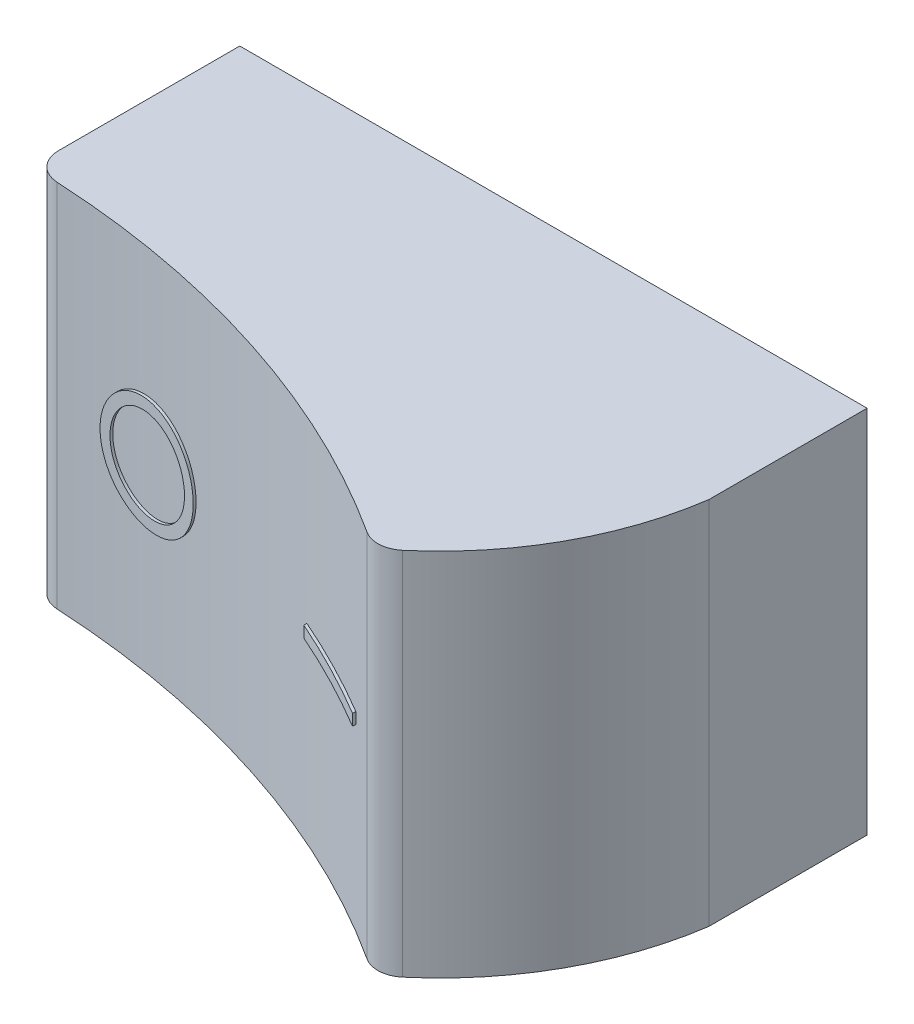
ISO-10303-21;
HEADER;
FILE_DESCRIPTION(('STEP AP214'),'2;1');
FILE_NAME('part.step','',(''),(''),'','','');
FILE_SCHEMA(('AUTOMOTIVE_DESIGN { 1 0 10303 214 1 1 1 1 }'));
ENDSEC;
DATA;
#1=APPLICATION_CONTEXT('core data for automotive mechanical design processes');
#2=APPLICATION_PROTOCOL_DEFINITION('international standard','automotive_design',2000,#1);
#3=PRODUCT_CONTEXT('',#1,'mechanical');
#4=PRODUCT('Part','Part','',(#3));
#5=PRODUCT_RELATED_PRODUCT_CATEGORY('part','',(#4));
#6=PRODUCT_DEFINITION_FORMATION('','',#4);
#7=PRODUCT_DEFINITION_CONTEXT('part definition',#1,'design');
#8=PRODUCT_DEFINITION('design','',#6,#7);
#9=PRODUCT_DEFINITION_SHAPE('','',#8);
#10=(LENGTH_UNIT() NAMED_UNIT(*) SI_UNIT(.MILLI.,.METRE.));
#11=(NAMED_UNIT(*) PLANE_ANGLE_UNIT() SI_UNIT($,.RADIAN.));
#12=(NAMED_UNIT(*) SI_UNIT($,.STERADIAN.) SOLID_ANGLE_UNIT());
#13=UNCERTAINTY_MEASURE_WITH_UNIT(LENGTH_MEASURE(1.E-05),#10,'distance_accuracy_value','');
#14=(GEOMETRIC_REPRESENTATION_CONTEXT(3) GLOBAL_UNCERTAINTY_ASSIGNED_CONTEXT((#13)) GLOBAL_UNIT_ASSIGNED_CONTEXT((#10,
#11,#12)) REPRESENTATION_CONTEXT('',''));
#15=CARTESIAN_POINT('',(0.,0.,0.));
#16=DIRECTION('',(0.,0.,1.));
#17=DIRECTION('',(1.,0.,0.));
#18=AXIS2_PLACEMENT_3D('',#15,#16,#17);
#19=CARTESIAN_POINT('',(-6.,3.3,18.5));
#20=DIRECTION('',(0.,1.,0.));
#21=DIRECTION('',(1.,0.,0.));
#22=AXIS2_PLACEMENT_3D('',#19,#20,#21);
#23=CYLINDRICAL_SURFACE('',#22,16.7);
#24=CARTESIAN_POINT('',(-2.437797,0.,2.18434157667));
#25=CARTESIAN_POINT('',(-2.437797,0.143559454474,2.18434157667));
#26=CARTESIAN_POINT('',(-2.467238186831,0.291320782114,2.177913456828));
#27=CARTESIAN_POINT('',(-2.529141722686,0.435038575923,2.164399287898));
#28=CARTESIAN_POINT('',(-2.62322846471,0.565982317,2.144165342547));
#29=CARTESIAN_POINT('',(-2.747015018645,0.675680441082,2.118553038056));
#30=CARTESIAN_POINT('',(-2.895642689646,0.756135951411,2.089594105694));
#31=CARTESIAN_POINT('',(-3.062569191844,0.8,2.059407897865));
#32=CARTESIAN_POINT('',(-3.413031506824,0.8,2.000631380248));
#33=CARTESIAN_POINT('',(-3.579967583641,0.756133071409,1.974825269804));
#34=CARTESIAN_POINT('',(-3.728771673054,0.675665229857,1.95387028493));
#35=CARTESIAN_POINT('',(-3.852802708263,0.565733522079,1.937852886978));
#36=CARTESIAN_POINT('',(-3.94695493205,0.434405938073,1.926426874065));
#37=CARTESIAN_POINT('',(-4.008626093738,0.290448430915,1.919128410533));
#38=CARTESIAN_POINT('',(-4.037797,0.142899684439,1.915677300933));
#39=CARTESIAN_POINT('',(-4.037797,-0.142899684439,1.915677300933));
#40=CARTESIAN_POINT('',(-4.008626093739,-0.290448430914,1.919128410533));
#41=CARTESIAN_POINT('',(-3.946954932048,-0.434405938077,1.926426874065));
#42=CARTESIAN_POINT('',(-3.852802708266,-0.565733522074,1.937852886977));
#43=CARTESIAN_POINT('',(-3.728771673053,-0.67566522986,1.95387028493));
#44=CARTESIAN_POINT('',(-3.579967583641,-0.756133071409,1.974825269804));
#45=CARTESIAN_POINT('',(-3.413031506824,-0.8,2.000631380248));
#46=CARTESIAN_POINT('',(-3.062569191845,-0.8,2.059407897865));
#47=CARTESIAN_POINT('',(-2.895642689644,-0.756135951411,2.089594105694));
#48=CARTESIAN_POINT('',(-2.747015018645,-0.67568044108,2.118553038056));
#49=CARTESIAN_POINT('',(-2.623228464711,-0.565982317002,2.144165342547));
#50=CARTESIAN_POINT('',(-2.529141722685,-0.435038575922,2.164399287898));
#51=CARTESIAN_POINT('',(-2.467238186831,-0.291320782114,2.177913456828));
#52=CARTESIAN_POINT('',(-2.437797,-0.143559454474,2.18434157667));
#53=CARTESIAN_POINT('',(-2.437797,0.,2.18434157667));
#54=(BOUNDED_CURVE() B_SPLINE_CURVE(8,(#24,#25,#26,#27,#28,#29,#30,#31,#32,#33,#34,#35,#36,#37,
#38,#39,#40,#41,#42,#43,#44,#45,#46,#47,#48,#49,#50,#51,#52,#53),.UNSPECIFIED.,.T.,
.F.) B_SPLINE_CURVE_WITH_KNOTS((9,7,7,7,9),(0.,0.249995221549,0.500000000001,0.750004778452,1.),
.UNSPECIFIED.) CURVE() GEOMETRIC_REPRESENTATION_ITEM() RATIONAL_B_SPLINE_CURVE((1.,1.,1.,1.,1.,
1.,1.,1.,1.,1.,1.,1.,1.,1.,1.,1.,1.,1.,1.,1.,1.,1.,1.,1.,1.,1.,1.,1.,1.,1.)) REPRESENTATION_ITEM(''));
#55=CARTESIAN_POINT('',(-2.437797,0.,2.18434157667));
#56=VERTEX_POINT('',#55);
#57=EDGE_CURVE('E9',#56,#56,#54,.T.);
#58=ORIENTED_EDGE('',*,*,#57,.T.);
#59=EDGE_LOOP('',(#58));
#60=FACE_BOUND('',#59,.T.);
#61=ADVANCED_FACE('F14',(#60),#23,.F.);
#62=CARTESIAN_POINT('',(-3.237797,0.,0.));
#63=DIRECTION('',(0.,0.,-1.));
#64=DIRECTION('',(1.,0.,0.));
#65=AXIS2_PLACEMENT_3D('',#62,#63,#64);
#66=CYLINDRICAL_SURFACE('',#65,0.8);
#67=DIRECTION('',(0.,0.,1.));
#68=VECTOR('',#67,1.);
#69=CARTESIAN_POINT('',(-2.437797,0.,0.));
#70=LINE('',#69,#68);
#71=CARTESIAN_POINT('',(-2.437797,0.,2.235523070606));
#72=VERTEX_POINT('',#71);
#73=EDGE_CURVE('E25',#56,#72,#70,.T.);
#74=ORIENTED_EDGE('',*,*,#73,.F.);
#75=ORIENTED_EDGE('',*,*,#57,.F.);
#76=ORIENTED_EDGE('',*,*,#73,.T.);
#77=CARTESIAN_POINT('',(-2.437797,0.,2.235523070606));
#78=CARTESIAN_POINT('',(-2.437797,0.143567073214,2.235523070606));
#79=CARTESIAN_POINT('',(-2.467241313344,0.29133356231,2.229074038096));
#80=CARTESIAN_POINT('',(-2.529149486178,0.435053066583,2.215516325382));
#81=CARTESIAN_POINT('',(-2.623240324888,0.565995221054,2.195217969739));
#82=CARTESIAN_POINT('',(-2.747028911084,0.675689515625,2.16952521983));
#83=CARTESIAN_POINT('',(-2.895655954997,0.756140349562,2.140476423683));
#84=CARTESIAN_POINT('',(-3.062577982478,0.8,2.110197606852));
#85=CARTESIAN_POINT('',(-3.413022957464,0.8,2.051242512647));
#86=CARTESIAN_POINT('',(-3.579954523536,0.756137351134,2.025357632672));
#87=CARTESIAN_POINT('',(-3.728758805713,0.675674182079,2.004338260718));
#88=CARTESIAN_POINT('',(-3.852793268003,0.565745101524,1.988271397941));
#89=CARTESIAN_POINT('',(-3.946950137226,0.434416921704,1.976809991061));
#90=CARTESIAN_POINT('',(-4.008624972326,0.29045584504,1.969488866453));
#91=CARTESIAN_POINT('',(-4.037797,0.142902427784,1.966027114248));
#92=CARTESIAN_POINT('',(-4.037797,-0.142902427784,1.966027114248));
#93=CARTESIAN_POINT('',(-4.008624972326,-0.29045584504,1.969488866453));
#94=CARTESIAN_POINT('',(-3.946950137226,-0.434416921704,1.976809991061));
#95=CARTESIAN_POINT('',(-3.852793268003,-0.565745101524,1.988271397941));
#96=CARTESIAN_POINT('',(-3.728758805713,-0.675674182079,2.004338260718));
#97=CARTESIAN_POINT('',(-3.579954523536,-0.756137351134,2.025357632672));
#98=CARTESIAN_POINT('',(-3.413022957464,-0.8,2.051242512647));
#99=CARTESIAN_POINT('',(-3.062577982476,-0.8,2.110197606852));
#100=CARTESIAN_POINT('',(-2.895655955,-0.756140349562,2.140476423682));
#101=CARTESIAN_POINT('',(-2.747028911081,-0.675689515627,2.16952521983));
#102=CARTESIAN_POINT('',(-2.623240324889,-0.565995221051,2.195217969739));
#103=CARTESIAN_POINT('',(-2.529149486178,-0.435053066585,2.215516325382));
#104=CARTESIAN_POINT('',(-2.467241313344,-0.29133356231,2.229074038096));
#105=CARTESIAN_POINT('',(-2.437797,-0.143567073214,2.235523070606));
#106=CARTESIAN_POINT('',(-2.437797,0.,2.235523070606));
#107=(BOUNDED_CURVE() B_SPLINE_CURVE(8,(#77,#78,#79,#80,#81,#82,#83,#84,#85,#86,#87,#88,#89,#90,
#91,#92,#93,#94,#95,#96,#97,#98,#99,#100,#101,#102,#103,#104,#105,#106),.UNSPECIFIED.,.T.,
.F.) B_SPLINE_CURVE_WITH_KNOTS((9,7,7,7,9),(0.,0.249995049193,0.499999999999,0.750004950805,1.),
.UNSPECIFIED.) CURVE() GEOMETRIC_REPRESENTATION_ITEM() RATIONAL_B_SPLINE_CURVE((1.,1.,1.,1.,1.,
1.,1.,1.,1.,1.,1.,1.,1.,1.,1.,1.,1.,1.,1.,1.,1.,1.,1.,1.,1.,1.,1.,1.,1.,1.)) REPRESENTATION_ITEM(''));
#108=EDGE_CURVE('E178',#72,#72,#107,.T.);
#109=ORIENTED_EDGE('',*,*,#108,.T.);
#110=EDGE_LOOP('',(#74,#75,#76,#109));
#111=FACE_BOUND('',#110,.T.);
#112=ADVANCED_FACE('F497',(#111),#66,.F.);
#113=CARTESIAN_POINT('',(-6.,-5.,18.5));
#114=DIRECTION('',(0.,-1.,0.));
#115=DIRECTION('',(1.,0.,0.));
#116=AXIS2_PLACEMENT_3D('',#113,#114,#115);
#117=CYLINDRICAL_SURFACE('',#116,16.65);
#118=DIRECTION('',(0.,-1.,0.));
#119=VECTOR('',#118,1.);
#120=CARTESIAN_POINT('',(2.525187330827,-5.,4.198123166021));
#121=LINE('',#120,#119);
#122=CARTESIAN_POINT('',(2.525187330827,0.1,4.198123166021));
#123=VERTEX_POINT('',#122);
#124=CARTESIAN_POINT('',(2.525187330827,-0.1,4.198123166021));
#125=VERTEX_POINT('',#124);
#126=EDGE_CURVE('E164',#123,#125,#121,.T.);
#127=ORIENTED_EDGE('',*,*,#126,.F.);
#128=CARTESIAN_POINT('',(-6.,0.1,18.5));
#129=DIRECTION('',(0.,-1.,0.));
#130=DIRECTION('',(1.,0.,0.));
#131=AXIS2_PLACEMENT_3D('',#128,#129,#130);
#132=CIRCLE('',#131,16.65);
#133=CARTESIAN_POINT('',(0.725187330827,0.1,3.268639083611));
#134=VERTEX_POINT('',#133);
#135=EDGE_CURVE('E233',#134,#123,#132,.T.);
#136=ORIENTED_EDGE('',*,*,#135,.F.);
#137=DIRECTION('',(0.,-1.,0.));
#138=VECTOR('',#137,1.);
#139=CARTESIAN_POINT('',(0.725187330827,-5.,3.268639083611));
#140=LINE('',#139,#138);
#141=CARTESIAN_POINT('',(0.725187330827,-0.1,3.268639083611));
#142=VERTEX_POINT('',#141);
#143=EDGE_CURVE('E226',#134,#142,#140,.T.);
#144=ORIENTED_EDGE('',*,*,#143,.T.);
#145=CARTESIAN_POINT('',(-6.,-0.1,18.5));
#146=DIRECTION('',(0.,-1.,0.));
#147=DIRECTION('',(1.,0.,0.));
#148=AXIS2_PLACEMENT_3D('',#145,#146,#147);
#149=CIRCLE('',#148,16.65);
#150=EDGE_CURVE('E146',#142,#125,#149,.T.);
#151=ORIENTED_EDGE('',*,*,#150,.T.);
#152=EDGE_LOOP('',(#127,#136,#144,#151));
#153=FACE_BOUND('',#152,.T.);
#154=ADVANCED_FACE('F503',(#153),#117,.F.);
#155=CARTESIAN_POINT('',(-6.,-5.,18.5));
#156=DIRECTION('',(0.,-1.,0.));
#157=DIRECTION('',(1.,0.,0.));
#158=AXIS2_PLACEMENT_3D('',#155,#156,#157);
#159=CYLINDRICAL_SURFACE('',#158,16.65);
#160=ORIENTED_EDGE('',*,*,#108,.F.);
#161=EDGE_LOOP('',(#160));
#162=FACE_BOUND('',#161,.T.);
#163=CARTESIAN_POINT('',(-2.237797,0.,2.280618736006));
#164=CARTESIAN_POINT('',(-2.237797,0.177178763022,2.280618736006));
#165=CARTESIAN_POINT('',(-2.2736736688,0.358797862551,2.272297154157));
#166=CARTESIAN_POINT('',(-2.348576045953,0.536127407444,2.254921390024));
#167=CARTESIAN_POINT('',(-2.46306184259,0.699563492789,2.228838855484));
#168=CARTESIAN_POINT('',(-2.61566639331,0.838833233007,2.195508662779));
#169=CARTESIAN_POINT('',(-2.801988898088,0.942743105776,2.157621956399));
#170=CARTESIAN_POINT('',(-3.013964917866,1.,2.118375746099));
#171=CARTESIAN_POINT('',(-3.462147518681,1.,2.042978324711));
#172=CARTESIAN_POINT('',(-3.674074524965,0.942476979752,2.010928366867));
#173=CARTESIAN_POINT('',(-3.860114338809,0.838573500655,1.986106406254));
#174=CARTESIAN_POINT('',(-4.01291864633,0.699414448598,1.967870579057));
#175=CARTESIAN_POINT('',(-4.12792955997,0.535382495611,1.955211262641));
#176=CARTESIAN_POINT('',(-4.202674204403,0.35702146052,1.947254875614));
#177=CARTESIAN_POINT('',(-4.237797,0.175309593052,1.943516660027));
#178=CARTESIAN_POINT('',(-4.237797,-0.105781979713,1.943516660027));
#179=CARTESIAN_POINT('',(-4.225008750708,-0.211720334108,1.94487781012));
#180=CARTESIAN_POINT('',(-4.199365351348,-0.316543498114,1.94760709834));
#181=CARTESIAN_POINT('',(-4.160747363301,-0.418905900222,1.951773517054));
#182=CARTESIAN_POINT('',(-4.109035942334,-0.517322185209,1.95750262352));
#183=CARTESIAN_POINT('',(-4.044155317117,-0.610109302965,1.964978014989));
#184=CARTESIAN_POINT('',(-3.966134859213,-0.695302749068,1.974435115447));
#185=CARTESIAN_POINT('',(-3.790450177597,-0.840641757506,1.997039821933));
#186=CARTESIAN_POINT('',(-3.69333107058,-0.903032968527,2.010041505535));
#187=CARTESIAN_POINT('',(-3.58541208924,-0.953784547903,2.025196547809));
#188=CARTESIAN_POINT('',(-3.469246641248,-0.990000010219,2.042440776065));
#189=CARTESIAN_POINT('',(-3.348024822808,-1.009821495826,2.061539526462));
#190=CARTESIAN_POINT('',(-3.225271418618,-1.012458629749,2.082038488354));
#191=CARTESIAN_POINT('',(-3.104549274006,-0.998223670264,2.103273420503));
#192=CARTESIAN_POINT('',(-2.809409201203,-0.922444579372,2.157539556287));
#193=CARTESIAN_POINT('',(-2.64864453748,-0.840554533082,2.189428558618));
#194=CARTESIAN_POINT('',(-2.511851586697,-0.73144018618,2.218398942373));
#195=CARTESIAN_POINT('',(-2.401502336255,-0.602120002376,2.24290445163));
#196=CARTESIAN_POINT('',(-2.318935042181,-0.458882816381,2.261798541973));
#197=CARTESIAN_POINT('',(-2.264490104431,-0.307386719609,2.274427000479));
#198=CARTESIAN_POINT('',(-2.237797,-0.152828792262,2.280618736006));
#199=CARTESIAN_POINT('',(-2.237797,0.,2.280618736006));
#200=(BOUNDED_CURVE() B_SPLINE_CURVE(8,(#163,#164,#165,#166,#167,#168,#169,#170,#171,#172,#173,
#174,#175,#176,#177,#178,#179,#180,#181,#182,#183,#184,#185,#186,#187,#188,#189,#190,#191,#192,
#193,#194,#195,#196,#197,#198,#199),.UNSPECIFIED.,.T.,.F.) B_SPLINE_CURVE_WITH_KNOTS((9,7,7,7,7,
9),(0.,0.246982664783,0.494537387148,0.643912148467,0.783193645409,1.),
.UNSPECIFIED.) CURVE() GEOMETRIC_REPRESENTATION_ITEM() RATIONAL_B_SPLINE_CURVE((1.,1.,1.,1.,1.,
1.,1.,1.,1.,1.,1.,1.,1.,1.,1.,1.,1.,1.,1.,1.,1.,1.,1.,1.,1.,1.,1.,1.,1.,1.,1.,1.,1.,1.,1.,1.,1.)) REPRESENTATION_ITEM(''));
#201=CARTESIAN_POINT('',(-2.237797,0.,2.280618736006));
#202=VERTEX_POINT('',#201);
#203=EDGE_CURVE('E144',#202,#202,#200,.T.);
#204=ORIENTED_EDGE('',*,*,#203,.T.);
#205=EDGE_LOOP('',(#204));
#206=FACE_BOUND('',#205,.T.);
#207=ADVANCED_FACE('F16',(#162,#206),#159,.F.);
#208=CARTESIAN_POINT('',(5.6,3.3,-1.913196));
#209=DIRECTION('',(-1.,0.,0.));
#210=DIRECTION('',(0.,0.,1.));
#211=AXIS2_PLACEMENT_3D('',#208,#209,#210);
#212=PLANE('',#211);
#213=DIRECTION('',(0.,0.,1.));
#214=VECTOR('',#213,1.);
#215=CARTESIAN_POINT('',(5.6,3.3,-1.913196));
#216=LINE('',#215,#214);
#217=CARTESIAN_POINT('',(5.6,3.3,-1.913196));
#218=VERTEX_POINT('',#217);
#219=CARTESIAN_POINT('',(5.6,3.3,0.909885000057));
#220=VERTEX_POINT('',#219);
#221=EDGE_CURVE('E206',#218,#220,#216,.T.);
#222=ORIENTED_EDGE('',*,*,#221,.T.);
#223=DIRECTION('',(0.,-1.,0.));
#224=VECTOR('',#223,1.);
#225=CARTESIAN_POINT('',(5.6,3.3,0.909885000057));
#226=LINE('',#225,#224);
#227=CARTESIAN_POINT('',(5.6,-3.3,0.909885000057));
#228=VERTEX_POINT('',#227);
#229=EDGE_CURVE('E179',#220,#228,#226,.T.);
#230=ORIENTED_EDGE('',*,*,#229,.T.);
#231=DIRECTION('',(0.,0.,1.));
#232=VECTOR('',#231,1.);
#233=CARTESIAN_POINT('',(5.6,-3.3,-1.913196));
#234=LINE('',#233,#232);
#235=CARTESIAN_POINT('',(5.6,-3.3,-1.913196));
#236=VERTEX_POINT('',#235);
#237=EDGE_CURVE('E264',#236,#228,#234,.T.);
#238=ORIENTED_EDGE('',*,*,#237,.F.);
#239=DIRECTION('',(0.,-1.,0.));
#240=VECTOR('',#239,1.);
#241=CARTESIAN_POINT('',(5.6,3.3,-1.913196));
#242=LINE('',#241,#240);
#243=EDGE_CURVE('E172',#218,#236,#242,.T.);
#244=ORIENTED_EDGE('',*,*,#243,.F.);
#245=EDGE_LOOP('',(#222,#230,#238,#244));
#246=FACE_BOUND('',#245,.T.);
#247=ADVANCED_FACE('F519',(#246),#212,.F.);
#248=CARTESIAN_POINT('',(-5.6,3.3,-1.913196));
#249=DIRECTION('',(0.,0.,1.));
#250=DIRECTION('',(0.,-1.,0.));
#251=AXIS2_PLACEMENT_3D('',#248,#249,#250);
#252=PLANE('',#251);
#253=DIRECTION('',(1.,0.,0.));
#254=VECTOR('',#253,1.);
#255=CARTESIAN_POINT('',(-5.6,3.3,-1.913196));
#256=LINE('',#255,#254);
#257=CARTESIAN_POINT('',(-5.6,3.3,-1.913196));
#258=VERTEX_POINT('',#257);
#259=EDGE_CURVE('E198',#258,#218,#256,.T.);
#260=ORIENTED_EDGE('',*,*,#259,.T.);
#261=ORIENTED_EDGE('',*,*,#243,.T.);
#262=DIRECTION('',(1.,0.,0.));
#263=VECTOR('',#262,1.);
#264=CARTESIAN_POINT('',(-5.6,-3.3,-1.913196));
#265=LINE('',#264,#263);
#266=CARTESIAN_POINT('',(-5.6,-3.3,-1.913196));
#267=VERTEX_POINT('',#266);
#268=EDGE_CURVE('E260',#267,#236,#265,.T.);
#269=ORIENTED_EDGE('',*,*,#268,.F.);
#270=DIRECTION('',(0.,-1.,0.));
#271=VECTOR('',#270,1.);
#272=CARTESIAN_POINT('',(-5.6,3.3,-1.913196));
#273=LINE('',#272,#271);
#274=EDGE_CURVE('E232',#258,#267,#273,.T.);
#275=ORIENTED_EDGE('',*,*,#274,.F.);
#276=EDGE_LOOP('',(#260,#261,#269,#275));
#277=FACE_BOUND('',#276,.T.);
#278=ADVANCED_FACE('F514',(#277),#252,.F.);
#279=CARTESIAN_POINT('',(0.,3.3,0.108141621394));
#280=DIRECTION('',(0.,1.,0.));
#281=DIRECTION('',(1.,0.,0.));
#282=AXIS2_PLACEMENT_3D('',#279,#280,#281);
#283=CYLINDRICAL_SURFACE('',#282,5.657101063728);
#284=CARTESIAN_POINT('',(3.649627592365,3.70392,4.430526481894));
#285=CARTESIAN_POINT('',(3.649627592365,3.50196,4.430526481894));
#286=CARTESIAN_POINT('',(3.649627592365,0.,4.430526481894));
#287=CARTESIAN_POINT('',(3.649627592365,-3.50196,4.430526481894));
#288=CARTESIAN_POINT('',(3.649627592365,-3.70392,4.430526481894));
#289=(BOUNDED_CURVE() B_SPLINE_CURVE(2,(#284,#285,#286,#287,#288),.UNSPECIFIED.,.F.,
.F.) B_SPLINE_CURVE_WITH_KNOTS((3,1,1,3),(-0.40392,0.,6.6,7.00392),
.UNSPECIFIED.) CURVE() GEOMETRIC_REPRESENTATION_ITEM() RATIONAL_B_SPLINE_CURVE((1.,1.,1.,1.,1.)) REPRESENTATION_ITEM(''));
#290=CARTESIAN_POINT('',(3.649627592365,3.3,4.430526481894));
#291=VERTEX_POINT('',#290);
#292=CARTESIAN_POINT('',(3.649627592365,-3.3,4.430526481894));
#293=VERTEX_POINT('',#292);
#294=EDGE_CURVE('E188',#291,#293,#289,.T.);
#295=ORIENTED_EDGE('',*,*,#294,.T.);
#296=CARTESIAN_POINT('',(0.,-3.3,0.108141621394));
#297=DIRECTION('',(0.,-1.,0.));
#298=DIRECTION('',(1.,0.,0.));
#299=AXIS2_PLACEMENT_3D('',#296,#297,#298);
#300=CIRCLE('',#299,5.657101063728);
#301=EDGE_CURVE('E18',#228,#293,#300,.T.);
#302=ORIENTED_EDGE('',*,*,#301,.F.);
#303=ORIENTED_EDGE('',*,*,#229,.F.);
#304=CARTESIAN_POINT('',(0.,3.3,0.108141621394));
#305=DIRECTION('',(0.,-1.,0.));
#306=DIRECTION('',(1.,0.,0.));
#307=AXIS2_PLACEMENT_3D('',#304,#305,#306);
#308=CIRCLE('',#307,5.657101063728);
#309=EDGE_CURVE('E158',#220,#291,#308,.T.);
#310=ORIENTED_EDGE('',*,*,#309,.T.);
#311=EDGE_LOOP('',(#295,#302,#303,#310));
#312=FACE_BOUND('',#311,.T.);
#313=ADVANCED_FACE('F491',(#312),#283,.T.);
#314=CARTESIAN_POINT('',(-5.6,3.3,1.804791106428));
#315=DIRECTION('',(1.,0.,0.));
#316=DIRECTION('',(0.,1.,0.));
#317=AXIS2_PLACEMENT_3D('',#314,#315,#316);
#318=PLANE('',#317);
#319=ORIENTED_EDGE('',*,*,#274,.T.);
#320=DIRECTION('',(0.,0.,-1.));
#321=VECTOR('',#320,1.);
#322=CARTESIAN_POINT('',(-5.6,-3.3,1.804791106428));
#323=LINE('',#322,#321);
#324=CARTESIAN_POINT('',(-5.6,-3.3,1.32356265112));
#325=VERTEX_POINT('',#324);
#326=EDGE_CURVE('E265',#325,#267,#323,.T.);
#327=ORIENTED_EDGE('',*,*,#326,.F.);
#328=DIRECTION('',(0.,-1.,0.));
#329=VECTOR('',#328,1.);
#330=CARTESIAN_POINT('',(-5.6,3.3,1.32356265112));
#331=LINE('',#330,#329);
#332=CARTESIAN_POINT('',(-5.6,3.3,1.32356265112));
#333=VERTEX_POINT('',#332);
#334=EDGE_CURVE('E254',#333,#325,#331,.T.);
#335=ORIENTED_EDGE('',*,*,#334,.F.);
#336=DIRECTION('',(0.,0.,-1.));
#337=VECTOR('',#336,1.);
#338=CARTESIAN_POINT('',(-5.6,3.3,1.804791106428));
#339=LINE('',#338,#337);
#340=EDGE_CURVE('E205',#333,#258,#339,.T.);
#341=ORIENTED_EDGE('',*,*,#340,.T.);
#342=EDGE_LOOP('',(#319,#327,#335,#341));
#343=FACE_BOUND('',#342,.T.);
#344=ADVANCED_FACE('F329',(#343),#318,.F.);
#345=CARTESIAN_POINT('',(0.725187330827,0.1,0.));
#346=DIRECTION('',(1.,0.,0.));
#347=DIRECTION('',(0.,1.,0.));
#348=AXIS2_PLACEMENT_3D('',#345,#346,#347);
#349=PLANE('',#348);
#350=ORIENTED_EDGE('',*,*,#143,.F.);
#351=DIRECTION('',(0.,0.,1.));
#352=VECTOR('',#351,1.);
#353=CARTESIAN_POINT('',(0.725187330827,0.1,0.));
#354=LINE('',#353,#352);
#355=CARTESIAN_POINT('',(0.725187330827,0.1,3.213998058181));
#356=VERTEX_POINT('',#355);
#357=EDGE_CURVE('E222',#356,#134,#354,.T.);
#358=ORIENTED_EDGE('',*,*,#357,.F.);
#359=DIRECTION('',(0.,1.,0.));
#360=VECTOR('',#359,1.);
#361=CARTESIAN_POINT('',(0.725187330827,3.3,3.213998058181));
#362=LINE('',#361,#360);
#363=CARTESIAN_POINT('',(0.725187330827,-0.1,3.213998058181));
#364=VERTEX_POINT('',#363);
#365=EDGE_CURVE('E318',#364,#356,#362,.T.);
#366=ORIENTED_EDGE('',*,*,#365,.F.);
#367=DIRECTION('',(0.,0.,1.));
#368=VECTOR('',#367,1.);
#369=CARTESIAN_POINT('',(0.725187330827,-0.1,0.));
#370=LINE('',#369,#368);
#371=EDGE_CURVE('E153',#364,#142,#370,.T.);
#372=ORIENTED_EDGE('',*,*,#371,.T.);
#373=EDGE_LOOP('',(#350,#358,#366,#372));
#374=FACE_BOUND('',#373,.T.);
#375=ADVANCED_FACE('F490',(#374),#349,.F.);
#376=CARTESIAN_POINT('',(2.525187330827,0.1,0.));
#377=DIRECTION('',(0.,-1.,0.));
#378=DIRECTION('',(-1.,0.,0.));
#379=AXIS2_PLACEMENT_3D('',#376,#377,#378);
#380=PLANE('',#379);
#381=ORIENTED_EDGE('',*,*,#357,.T.);
#382=ORIENTED_EDGE('',*,*,#135,.T.);
#383=DIRECTION('',(0.,0.,1.));
#384=VECTOR('',#383,1.);
#385=CARTESIAN_POINT('',(2.525187330827,0.1,0.));
#386=LINE('',#385,#384);
#387=CARTESIAN_POINT('',(2.525187330827,0.1,4.139944952253));
#388=VERTEX_POINT('',#387);
#389=EDGE_CURVE('E160',#388,#123,#386,.T.);
#390=ORIENTED_EDGE('',*,*,#389,.F.);
#391=CARTESIAN_POINT('',(-6.,0.1,18.5));
#392=DIRECTION('',(0.,1.,0.));
#393=DIRECTION('',(1.,0.,0.));
#394=AXIS2_PLACEMENT_3D('',#391,#392,#393);
#395=CIRCLE('',#394,16.7);
#396=EDGE_CURVE('E303',#388,#356,#395,.T.);
#397=ORIENTED_EDGE('',*,*,#396,.T.);
#398=EDGE_LOOP('',(#381,#382,#390,#397));
#399=FACE_BOUND('',#398,.T.);
#400=ADVANCED_FACE('F537',(#399),#380,.F.);
#401=CARTESIAN_POINT('',(2.525187330827,-0.1,0.));
#402=DIRECTION('',(-1.,0.,0.));
#403=DIRECTION('',(0.,0.,1.));
#404=AXIS2_PLACEMENT_3D('',#401,#402,#403);
#405=PLANE('',#404);
#406=ORIENTED_EDGE('',*,*,#389,.T.);
#407=ORIENTED_EDGE('',*,*,#126,.T.);
#408=DIRECTION('',(0.,0.,1.));
#409=VECTOR('',#408,1.);
#410=CARTESIAN_POINT('',(2.525187330827,-0.1,0.));
#411=LINE('',#410,#409);
#412=CARTESIAN_POINT('',(2.525187330827,-0.1,4.139944952253));
#413=VERTEX_POINT('',#412);
#414=EDGE_CURVE('E130',#413,#125,#411,.T.);
#415=ORIENTED_EDGE('',*,*,#414,.F.);
#416=DIRECTION('',(0.,1.,0.));
#417=VECTOR('',#416,1.);
#418=CARTESIAN_POINT('',(2.525187330827,3.3,4.139944952253));
#419=LINE('',#418,#417);
#420=EDGE_CURVE('E217',#413,#388,#419,.T.);
#421=ORIENTED_EDGE('',*,*,#420,.T.);
#422=EDGE_LOOP('',(#406,#407,#415,#421));
#423=FACE_BOUND('',#422,.T.);
#424=ADVANCED_FACE('F610',(#423),#405,.F.);
#425=CARTESIAN_POINT('',(0.725187330827,-0.1,0.));
#426=DIRECTION('',(0.,1.,0.));
#427=DIRECTION('',(0.,0.,-1.));
#428=AXIS2_PLACEMENT_3D('',#425,#426,#427);
#429=PLANE('',#428);
#430=ORIENTED_EDGE('',*,*,#150,.F.);
#431=ORIENTED_EDGE('',*,*,#371,.F.);
#432=CARTESIAN_POINT('',(-6.,-0.1,18.5));
#433=DIRECTION('',(0.,1.,0.));
#434=DIRECTION('',(1.,0.,0.));
#435=AXIS2_PLACEMENT_3D('',#432,#433,#434);
#436=CIRCLE('',#435,16.7);
#437=EDGE_CURVE('E246',#413,#364,#436,.T.);
#438=ORIENTED_EDGE('',*,*,#437,.F.);
#439=ORIENTED_EDGE('',*,*,#414,.T.);
#440=EDGE_LOOP('',(#430,#431,#438,#439));
#441=FACE_BOUND('',#440,.T.);
#442=ADVANCED_FACE('F575',(#441),#429,.F.);
#443=CARTESIAN_POINT('',(-3.237797,0.,0.));
#444=DIRECTION('',(0.,0.,-1.));
#445=DIRECTION('',(1.,0.,0.));
#446=AXIS2_PLACEMENT_3D('',#443,#444,#445);
#447=CYLINDRICAL_SURFACE('',#446,1.);
#448=ORIENTED_EDGE('',*,*,#203,.F.);
#449=DIRECTION('',(0.,0.,1.));
#450=VECTOR('',#449,1.);
#451=CARTESIAN_POINT('',(-2.237797,0.,0.));
#452=LINE('',#451,#450);
#453=CARTESIAN_POINT('',(-2.237797,0.,2.229295387513));
#454=VERTEX_POINT('',#453);
#455=EDGE_CURVE('E139',#454,#202,#452,.T.);
#456=ORIENTED_EDGE('',*,*,#455,.F.);
#457=CARTESIAN_POINT('',(-2.237797,0.,2.229295387513));
#458=CARTESIAN_POINT('',(-2.237797,0.17713881255,2.229295387513));
#459=CARTESIAN_POINT('',(-2.273657527449,0.3587778795,2.221003793009));
#460=CARTESIAN_POINT('',(-2.348569059617,0.536123526937,2.203680686136));
#461=CARTESIAN_POINT('',(-2.46305884902,0.69955463316,2.177679036096));
#462=CARTESIAN_POINT('',(-2.615652856351,0.838814147714,2.144456454792));
#463=CARTESIAN_POINT('',(-2.801956665784,0.942726653845,2.106690606964));
#464=CARTESIAN_POINT('',(-3.013932769592,1.,2.067564779239));
#465=CARTESIAN_POINT('',(-3.462162531742,1.,1.992391548379));
#466=CARTESIAN_POINT('',(-3.674097106567,0.942469208386,1.960438877307));
#467=CARTESIAN_POINT('',(-3.8601308447,0.838558354013,1.935693812821));
#468=CARTESIAN_POINT('',(-4.012933923458,0.699399778168,1.917513457441));
#469=CARTESIAN_POINT('',(-4.127935615839,0.535363628844,1.90489370824));
#470=CARTESIAN_POINT('',(-4.20267608111,0.357012743495,1.896961779765));
#471=CARTESIAN_POINT('',(-4.237797,0.175304537853,1.893235095697));
#472=CARTESIAN_POINT('',(-4.237797,-0.105781278136,1.893235095697));
#473=CARTESIAN_POINT('',(-4.225008920367,-0.211718697322,1.894592106548));
#474=CARTESIAN_POINT('',(-4.199365959417,-0.316540986472,1.897313084497));
#475=CARTESIAN_POINT('',(-4.160748598553,-0.418902847496,1.901466816538));
#476=CARTESIAN_POINT('',(-4.109037778147,-0.517319125791,1.907178489461));
#477=CARTESIAN_POINT('',(-4.044157403427,-0.610106851481,1.914631163912));
#478=CARTESIAN_POINT('',(-3.966136456391,-0.695301427767,1.924059582816));
#479=CARTESIAN_POINT('',(-3.790454320089,-0.840638330539,1.946595168726));
#480=CARTESIAN_POINT('',(-3.693338613259,-0.903028484267,1.959556748422));
#481=CARTESIAN_POINT('',(-3.58542187446,-0.953780651926,1.974665151328));
#482=CARTESIAN_POINT('',(-3.469257237854,-0.989997629467,1.991856417283));
#483=CARTESIAN_POINT('',(-3.348034707085,-1.009820865456,2.010896605459));
#484=CARTESIAN_POINT('',(-3.22527914883,-1.012459352913,2.031332788427));
#485=CARTESIAN_POINT('',(-3.104553620451,-0.998224786241,2.052502745233));
#486=CARTESIAN_POINT('',(-2.809397517297,-0.922441579455,2.106603878664));
#487=CARTESIAN_POINT('',(-2.648627640847,-0.840544913892,2.138394980361));
#488=CARTESIAN_POINT('',(-2.511835083744,-0.731424683775,2.167275008931));
#489=CARTESIAN_POINT('',(-2.401489661292,-0.60210135811,2.191702860458));
#490=CARTESIAN_POINT('',(-2.318927594682,-0.458864599267,2.21053628135));
#491=CARTESIAN_POINT('',(-2.264487378825,-0.307372392234,2.223123812954));
#492=CARTESIAN_POINT('',(-2.237797,-0.15282099068,2.229295387513));
#493=CARTESIAN_POINT('',(-2.237797,0.,2.229295387513));
#494=(BOUNDED_CURVE() B_SPLINE_CURVE(8,(#457,#458,#459,#460,#461,#462,#463,#464,#465,#466,#467,
#468,#469,#470,#471,#472,#473,#474,#475,#476,#477,#478,#479,#480,#481,#482,#483,#484,#485,#486,
#487,#488,#489,#490,#491,#492,#493),.UNSPECIFIED.,.T.,.F.) B_SPLINE_CURVE_WITH_KNOTS((9,7,7,7,7,
9),(0.,0.24699853552,0.494550177246,0.643926396408,0.783199999595,1.),
.UNSPECIFIED.) CURVE() GEOMETRIC_REPRESENTATION_ITEM() RATIONAL_B_SPLINE_CURVE((1.,1.,1.,1.,1.,
1.,1.,1.,1.,1.,1.,1.,1.,1.,1.,1.,1.,1.,1.,1.,1.,1.,1.,1.,1.,1.,1.,1.,1.,1.,1.,1.,1.,1.,1.,1.,1.)) REPRESENTATION_ITEM(''));
#495=EDGE_CURVE('E142',#454,#454,#494,.T.);
#496=ORIENTED_EDGE('',*,*,#495,.T.);
#497=ORIENTED_EDGE('',*,*,#455,.T.);
#498=EDGE_LOOP('',(#448,#456,#496,#497));
#499=FACE_BOUND('',#498,.T.);
#500=ADVANCED_FACE('F140',(#499),#447,.T.);
#501=CARTESIAN_POINT('',(0.205197768431,-3.3,0.54172899297));
#502=DIRECTION('',(0.,1.,0.));
#503=DIRECTION('',(0.,0.,-1.));
#504=AXIS2_PLACEMENT_3D('',#501,#502,#503);
#505=PLANE('',#504);
#506=CARTESIAN_POINT('',(-5.1,-3.3,1.32356265112));
#507=DIRECTION('',(0.,-1.,0.));
#508=DIRECTION('',(0.,0.,-1.));
#509=AXIS2_PLACEMENT_3D('',#506,#507,#508);
#510=CIRCLE('',#509,0.5);
#511=CARTESIAN_POINT('',(-5.126162790698,-3.3,1.822877690332));
#512=VERTEX_POINT('',#511);
#513=EDGE_CURVE('E189',#512,#325,#510,.T.);
#514=ORIENTED_EDGE('',*,*,#513,.T.);
#515=ORIENTED_EDGE('',*,*,#326,.T.);
#516=ORIENTED_EDGE('',*,*,#268,.T.);
#517=ORIENTED_EDGE('',*,*,#237,.T.);
#518=ORIENTED_EDGE('',*,*,#301,.T.);
#519=CARTESIAN_POINT('',(3.055921732797,-3.3,4.468596593018));
#520=CARTESIAN_POINT('',(3.091646903335,-3.3,4.491653755506));
#521=CARTESIAN_POINT('',(3.130820193319,-3.3,4.51191542646));
#522=CARTESIAN_POINT('',(3.173142244134,-3.3,4.528602290853));
#523=CARTESIAN_POINT('',(3.218060641491,-3.3,4.54094883542));
#524=CARTESIAN_POINT('',(3.264710662964,-3.3,4.548332035984));
#525=CARTESIAN_POINT('',(3.312047543218,-3.3,4.5504840315));
#526=CARTESIAN_POINT('',(3.406058110628,-3.3,4.544455806091));
#527=CARTESIAN_POINT('',(3.452732457018,-3.3,4.536275542894));
#528=CARTESIAN_POINT('',(3.498057437512,-3.3,4.522994643177));
#529=CARTESIAN_POINT('',(3.541031054556,-3.3,4.505012212251));
#530=CARTESIAN_POINT('',(3.58087524062,-3.3,4.483056614665));
#531=CARTESIAN_POINT('',(3.617139877352,-3.3,4.457957648935));
#532=CARTESIAN_POINT('',(3.649627592365,-3.3,4.430526481894));
#533=(BOUNDED_CURVE() B_SPLINE_CURVE(7,(#519,#520,#521,#522,#523,#524,#525,#526,#527,#528,#529,
#530,#531,#532),.UNSPECIFIED.,.F.,.F.) B_SPLINE_CURVE_WITH_KNOTS((8,6,8),(0.,0.5,1.),
.UNSPECIFIED.) CURVE() GEOMETRIC_REPRESENTATION_ITEM() RATIONAL_B_SPLINE_CURVE((1.,1.,1.,1.,1.,
1.,1.,1.,1.,1.,1.,1.,1.,1.)) REPRESENTATION_ITEM(''));
#534=CARTESIAN_POINT('',(3.055921732797,-3.3,4.468596593018));
#535=VERTEX_POINT('',#534);
#536=EDGE_CURVE('E182',#535,#293,#533,.T.);
#537=ORIENTED_EDGE('',*,*,#536,.F.);
#538=CARTESIAN_POINT('',(-6.,-3.3,18.5));
#539=DIRECTION('',(0.,-1.,0.));
#540=DIRECTION('',(1.,0.,0.));
#541=AXIS2_PLACEMENT_3D('',#538,#539,#540);
#542=CIRCLE('',#541,16.7);
#543=EDGE_CURVE('E171',#512,#535,#542,.T.);
#544=ORIENTED_EDGE('',*,*,#543,.F.);
#545=EDGE_LOOP('',(#514,#515,#516,#517,#518,#537,#544));
#546=FACE_BOUND('',#545,.T.);
#547=ADVANCED_FACE('F332',(#546),#505,.F.);
#548=CARTESIAN_POINT('',(3.055921732797,3.70392,4.468596593018));
#549=CARTESIAN_POINT('',(3.055921732797,3.50196,4.468596593018));
#550=CARTESIAN_POINT('',(3.055921732797,0.,4.468596593018));
#551=CARTESIAN_POINT('',(3.055921732797,-3.50196,4.468596593018));
#552=CARTESIAN_POINT('',(3.055921732797,-3.70392,4.468596593018));
#553=CARTESIAN_POINT('',(3.366863615863,3.70392,4.669279680435));
#554=CARTESIAN_POINT('',(3.366863615863,3.50196,4.669279680435));
#555=CARTESIAN_POINT('',(3.366863615863,0.,4.669279680435));
#556=CARTESIAN_POINT('',(3.366863615863,-3.50196,4.669279680435));
#557=CARTESIAN_POINT('',(3.366863615863,-3.70392,4.669279680435));
#558=CARTESIAN_POINT('',(3.649627592365,3.70392,4.430526481894));
#559=CARTESIAN_POINT('',(3.649627592365,3.50196,4.430526481894));
#560=CARTESIAN_POINT('',(3.649627592365,0.,4.430526481894));
#561=CARTESIAN_POINT('',(3.649627592365,-3.50196,4.430526481894));
#562=CARTESIAN_POINT('',(3.649627592365,-3.70392,4.430526481894));
#563=(BOUNDED_SURFACE() B_SPLINE_SURFACE(2,2,((#548,#549,#550,#551,#552),(#553,#554,#555,#556,
#557),(#558,#559,#560,#561,#562)),.UNSPECIFIED.,.F.,.F.,.F.) B_SPLINE_SURFACE_WITH_KNOTS((3,3),
(3,1,1,3),(0.,6.6),(-0.40392,0.,6.6,7.00392),
.UNSPECIFIED.) GEOMETRIC_REPRESENTATION_ITEM() RATIONAL_B_SPLINE_SURFACE(((1.,1.,1.,1.,1.),
(0.803781076509,0.803781076509,0.803781076509,0.803781076509,0.803781076509),(1.,1.,1.,1.,1.))) REPRESENTATION_ITEM('') SURFACE());
#564=CARTESIAN_POINT('',(3.055921732797,3.70392,4.468596593018));
#565=CARTESIAN_POINT('',(3.055921732797,3.50196,4.468596593018));
#566=CARTESIAN_POINT('',(3.055921732797,0.,4.468596593018));
#567=CARTESIAN_POINT('',(3.055921732797,-3.50196,4.468596593018));
#568=CARTESIAN_POINT('',(3.055921732797,-3.70392,4.468596593018));
#569=(BOUNDED_CURVE() B_SPLINE_CURVE(2,(#564,#565,#566,#567,#568),.UNSPECIFIED.,.F.,
.F.) B_SPLINE_CURVE_WITH_KNOTS((3,1,1,3),(-0.40392,0.,6.6,7.00392),
.UNSPECIFIED.) CURVE() GEOMETRIC_REPRESENTATION_ITEM() RATIONAL_B_SPLINE_CURVE((1.,1.,1.,1.,1.)) REPRESENTATION_ITEM(''));
#570=CARTESIAN_POINT('',(3.055921732797,3.3,4.468596593018));
#571=VERTEX_POINT('',#570);
#572=EDGE_CURVE('E165',#571,#535,#569,.T.);
#573=CARTESIAN_POINT('',(3.055921732797,3.3,4.468596593018));
#574=CARTESIAN_POINT('',(3.091646903335,3.3,4.491653755506));
#575=CARTESIAN_POINT('',(3.130820193319,3.3,4.51191542646));
#576=CARTESIAN_POINT('',(3.173142244134,3.3,4.528602290853));
#577=CARTESIAN_POINT('',(3.218060641491,3.3,4.54094883542));
#578=CARTESIAN_POINT('',(3.264710662964,3.3,4.548332035984));
#579=CARTESIAN_POINT('',(3.312047543218,3.3,4.5504840315));
#580=CARTESIAN_POINT('',(3.406058110628,3.3,4.544455806091));
#581=CARTESIAN_POINT('',(3.452732457018,3.3,4.536275542894));
#582=CARTESIAN_POINT('',(3.498057437512,3.3,4.522994643177));
#583=CARTESIAN_POINT('',(3.541031054556,3.3,4.505012212251));
#584=CARTESIAN_POINT('',(3.58087524062,3.3,4.483056614665));
#585=CARTESIAN_POINT('',(3.617139877352,3.3,4.457957648935));
#586=CARTESIAN_POINT('',(3.649627592365,3.3,4.430526481894));
#587=(BOUNDED_CURVE() B_SPLINE_CURVE(7,(#573,#574,#575,#576,#577,#578,#579,#580,#581,#582,#583,
#584,#585,#586),.UNSPECIFIED.,.F.,.F.) B_SPLINE_CURVE_WITH_KNOTS((8,6,8),(0.,0.5,1.),
.UNSPECIFIED.) CURVE() GEOMETRIC_REPRESENTATION_ITEM() RATIONAL_B_SPLINE_CURVE((1.,1.,1.,1.,1.,
1.,1.,1.,1.,1.,1.,1.,1.,1.)) REPRESENTATION_ITEM(''));
#588=EDGE_CURVE('E211',#571,#291,#587,.T.);
#589=ORIENTED_EDGE('',*,*,#572,.T.);
#590=ORIENTED_EDGE('',*,*,#536,.T.);
#591=ORIENTED_EDGE('',*,*,#294,.F.);
#592=ORIENTED_EDGE('',*,*,#588,.F.);
#593=EDGE_LOOP('',(#589,#590,#591,#592));
#594=FACE_BOUND('',#593,.T.);
#595=ADVANCED_FACE('F336',(#594),#563,.F.);
#596=CARTESIAN_POINT('',(-5.1,3.3,1.32356265112));
#597=DIRECTION('',(0.,-1.,0.));
#598=DIRECTION('',(-0.0523255813953634,0.,0.998630078423255));
#599=AXIS2_PLACEMENT_3D('',#596,#597,#598);
#600=CYLINDRICAL_SURFACE('',#599,0.5);
#601=CARTESIAN_POINT('',(-5.1,3.3,1.32356265112));
#602=DIRECTION('',(0.,-1.,0.));
#603=DIRECTION('',(0.,0.,-1.));
#604=AXIS2_PLACEMENT_3D('',#601,#602,#603);
#605=CIRCLE('',#604,0.5);
#606=CARTESIAN_POINT('',(-5.126162790698,3.3,1.822877690332));
#607=VERTEX_POINT('',#606);
#608=EDGE_CURVE('E312',#607,#333,#605,.T.);
#609=ORIENTED_EDGE('',*,*,#608,.T.);
#610=ORIENTED_EDGE('',*,*,#334,.T.);
#611=ORIENTED_EDGE('',*,*,#513,.F.);
#612=DIRECTION('',(0.,-1.,0.));
#613=VECTOR('',#612,1.);
#614=CARTESIAN_POINT('',(-5.126162790698,3.3,1.822877690332));
#615=LINE('',#614,#613);
#616=EDGE_CURVE('E210',#607,#512,#615,.T.);
#617=ORIENTED_EDGE('',*,*,#616,.F.);
#618=EDGE_LOOP('',(#609,#610,#611,#617));
#619=FACE_BOUND('',#618,.T.);
#620=ADVANCED_FACE('F324',(#619),#600,.T.);
#621=CARTESIAN_POINT('',(0.205197768431,3.3,0.54172899297));
#622=DIRECTION('',(0.,1.,0.));
#623=DIRECTION('',(0.,0.,-1.));
#624=AXIS2_PLACEMENT_3D('',#621,#622,#623);
#625=PLANE('',#624);
#626=CARTESIAN_POINT('',(-6.,3.3,18.5));
#627=DIRECTION('',(0.,-1.,0.));
#628=DIRECTION('',(1.,0.,0.));
#629=AXIS2_PLACEMENT_3D('',#626,#627,#628);
#630=CIRCLE('',#629,16.7);
#631=EDGE_CURVE('E288',#607,#571,#630,.T.);
#632=ORIENTED_EDGE('',*,*,#631,.T.);
#633=ORIENTED_EDGE('',*,*,#588,.T.);
#634=ORIENTED_EDGE('',*,*,#309,.F.);
#635=ORIENTED_EDGE('',*,*,#221,.F.);
#636=ORIENTED_EDGE('',*,*,#259,.F.);
#637=ORIENTED_EDGE('',*,*,#340,.F.);
#638=ORIENTED_EDGE('',*,*,#608,.F.);
#639=EDGE_LOOP('',(#632,#633,#634,#635,#636,#637,#638));
#640=FACE_BOUND('',#639,.T.);
#641=ADVANCED_FACE('F326',(#640),#625,.T.);
#642=CARTESIAN_POINT('',(-6.,3.3,18.5));
#643=DIRECTION('',(0.,1.,0.));
#644=DIRECTION('',(1.,0.,0.));
#645=AXIS2_PLACEMENT_3D('',#642,#643,#644);
#646=CYLINDRICAL_SURFACE('',#645,16.7);
#647=ORIENTED_EDGE('',*,*,#437,.T.);
#648=ORIENTED_EDGE('',*,*,#365,.T.);
#649=ORIENTED_EDGE('',*,*,#396,.F.);
#650=ORIENTED_EDGE('',*,*,#420,.F.);
#651=EDGE_LOOP('',(#647,#648,#649,#650));
#652=FACE_BOUND('',#651,.T.);
#653=ORIENTED_EDGE('',*,*,#495,.F.);
#654=EDGE_LOOP('',(#653));
#655=FACE_BOUND('',#654,.T.);
#656=ORIENTED_EDGE('',*,*,#631,.F.);
#657=ORIENTED_EDGE('',*,*,#616,.T.);
#658=ORIENTED_EDGE('',*,*,#543,.T.);
#659=ORIENTED_EDGE('',*,*,#572,.F.);
#660=EDGE_LOOP('',(#656,#657,#658,#659));
#661=FACE_BOUND('',#660,.T.);
#662=ADVANCED_FACE('F334',(#652,#655,#661),#646,.F.);
#663=CLOSED_SHELL('',(#61,#112,#154,#207,#247,#278,#313,#344,#375,#400,#424,#442,#500,#547,#595,
#620,#641,#662));
#664=MANIFOLD_SOLID_BREP('B1',#663);
#665=ADVANCED_BREP_SHAPE_REPRESENTATION('',(#18,#664),#14);
#666=SHAPE_DEFINITION_REPRESENTATION(#9,#665);
ENDSEC;
END-ISO-10303-21;
